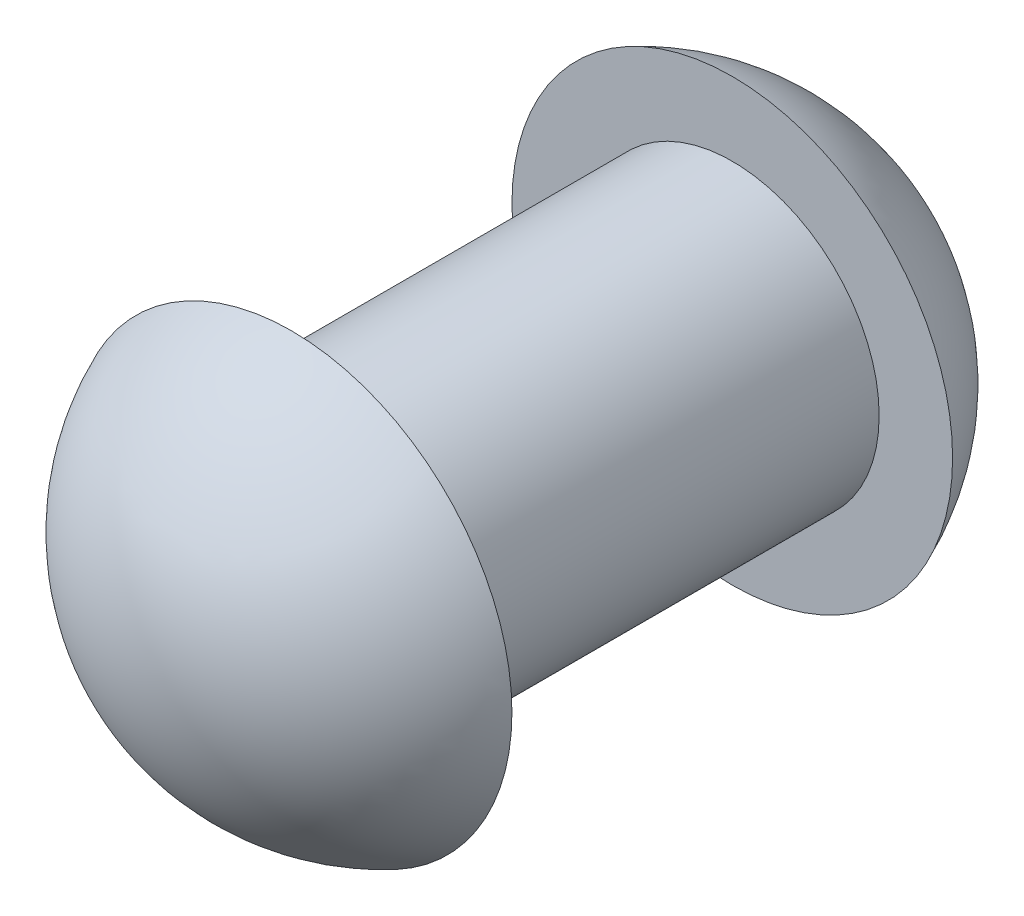
ISO-10303-21;
HEADER;
FILE_DESCRIPTION(('STEP AP214'),'2;1');
FILE_NAME('part.step','',(''),(''),'','','');
FILE_SCHEMA(('AUTOMOTIVE_DESIGN { 1 0 10303 214 1 1 1 1 }'));
ENDSEC;
DATA;
#1=APPLICATION_CONTEXT('core data for automotive mechanical design processes');
#2=APPLICATION_PROTOCOL_DEFINITION('international standard','automotive_design',2000,#1);
#3=PRODUCT_CONTEXT('',#1,'mechanical');
#4=PRODUCT('Part','Part','',(#3));
#5=PRODUCT_RELATED_PRODUCT_CATEGORY('part','',(#4));
#6=PRODUCT_DEFINITION_FORMATION('','',#4);
#7=PRODUCT_DEFINITION_CONTEXT('part definition',#1,'design');
#8=PRODUCT_DEFINITION('design','',#6,#7);
#9=PRODUCT_DEFINITION_SHAPE('','',#8);
#10=(LENGTH_UNIT() NAMED_UNIT(*) SI_UNIT(.MILLI.,.METRE.));
#11=(NAMED_UNIT(*) PLANE_ANGLE_UNIT() SI_UNIT($,.RADIAN.));
#12=(NAMED_UNIT(*) SI_UNIT($,.STERADIAN.) SOLID_ANGLE_UNIT());
#13=UNCERTAINTY_MEASURE_WITH_UNIT(LENGTH_MEASURE(1.E-05),#10,'distance_accuracy_value','');
#14=(GEOMETRIC_REPRESENTATION_CONTEXT(3) GLOBAL_UNCERTAINTY_ASSIGNED_CONTEXT((#13)) GLOBAL_UNIT_ASSIGNED_CONTEXT((#10,
#11,#12)) REPRESENTATION_CONTEXT('',''));
#15=CARTESIAN_POINT('',(0.,0.,0.));
#16=DIRECTION('',(0.,0.,1.));
#17=DIRECTION('',(1.,0.,0.));
#18=AXIS2_PLACEMENT_3D('',#15,#16,#17);
#19=CARTESIAN_POINT('',(0.,0.,-0.875));
#20=DIRECTION('',(0.,0.,-1.));
#21=DIRECTION('',(1.,0.,0.));
#22=AXIS2_PLACEMENT_3D('',#19,#20,#21);
#23=SPHERICAL_SURFACE('',#22,1.625);
#24=CARTESIAN_POINT('',(0.,0.,-1.5));
#25=DIRECTION('',(0.,0.,-1.));
#26=DIRECTION('',(-1.,0.,0.));
#27=AXIS2_PLACEMENT_3D('',#24,#25,#26);
#28=CIRCLE('',#27,1.5);
#29=CARTESIAN_POINT('',(-1.5,0.,-1.5));
#30=VERTEX_POINT('',#29);
#31=EDGE_CURVE('E10',#30,#30,#28,.T.);
#32=ORIENTED_EDGE('',*,*,#31,.T.);
#33=EDGE_LOOP('',(#32));
#34=FACE_BOUND('',#33,.T.);
#35=ADVANCED_FACE('F37',(#34),#23,.T.);
#36=CARTESIAN_POINT('',(1.5,0.,-1.5));
#37=DIRECTION('',(0.,0.,-1.));
#38=DIRECTION('',(-1.,0.,0.));
#39=AXIS2_PLACEMENT_3D('',#36,#37,#38);
#40=PLANE('',#39);
#41=ORIENTED_EDGE('',*,*,#31,.F.);
#42=EDGE_LOOP('',(#41));
#43=FACE_BOUND('',#42,.T.);
#44=CARTESIAN_POINT('',(0.,0.,-1.5));
#45=DIRECTION('',(0.,0.,-1.));
#46=DIRECTION('',(-1.,0.,0.));
#47=AXIS2_PLACEMENT_3D('',#44,#45,#46);
#48=CIRCLE('',#47,1.);
#49=CARTESIAN_POINT('',(-1.,0.,-1.5));
#50=VERTEX_POINT('',#49);
#51=EDGE_CURVE('E44',#50,#50,#48,.T.);
#52=ORIENTED_EDGE('',*,*,#51,.T.);
#53=EDGE_LOOP('',(#52));
#54=FACE_BOUND('',#53,.T.);
#55=ADVANCED_FACE('F73',(#43,#54),#40,.F.);
#56=CARTESIAN_POINT('',(0.,0.,-2.5));
#57=DIRECTION('',(0.,0.,-1.));
#58=DIRECTION('',(-1.,0.,0.));
#59=AXIS2_PLACEMENT_3D('',#56,#57,#58);
#60=CYLINDRICAL_SURFACE('',#59,1.);
#61=ORIENTED_EDGE('',*,*,#51,.F.);
#62=EDGE_LOOP('',(#61));
#63=FACE_BOUND('',#62,.T.);
#64=CARTESIAN_POINT('',(0.,0.,1.5));
#65=DIRECTION('',(0.,0.,-1.));
#66=DIRECTION('',(-1.,0.,0.));
#67=AXIS2_PLACEMENT_3D('',#64,#65,#66);
#68=CIRCLE('',#67,1.);
#69=CARTESIAN_POINT('',(-0.999999999999999,0.,1.5));
#70=VERTEX_POINT('',#69);
#71=EDGE_CURVE('E49',#70,#70,#68,.T.);
#72=ORIENTED_EDGE('',*,*,#71,.T.);
#73=EDGE_LOOP('',(#72));
#74=FACE_BOUND('',#73,.T.);
#75=ADVANCED_FACE('F69',(#63,#74),#60,.T.);
#76=CARTESIAN_POINT('',(1.,0.,1.5));
#77=DIRECTION('',(0.,0.,1.));
#78=DIRECTION('',(1.,0.,0.));
#79=AXIS2_PLACEMENT_3D('',#76,#77,#78);
#80=PLANE('',#79);
#81=ORIENTED_EDGE('',*,*,#71,.F.);
#82=EDGE_LOOP('',(#81));
#83=FACE_BOUND('',#82,.T.);
#84=CARTESIAN_POINT('',(0.,0.,1.5));
#85=DIRECTION('',(0.,0.,-1.));
#86=DIRECTION('',(-1.,0.,0.));
#87=AXIS2_PLACEMENT_3D('',#84,#85,#86);
#88=CIRCLE('',#87,1.5);
#89=CARTESIAN_POINT('',(-1.5,0.,1.5));
#90=VERTEX_POINT('',#89);
#91=EDGE_CURVE('E54',#90,#90,#88,.T.);
#92=ORIENTED_EDGE('',*,*,#91,.T.);
#93=EDGE_LOOP('',(#92));
#94=FACE_BOUND('',#93,.T.);
#95=ADVANCED_FACE('F61',(#83,#94),#80,.F.);
#96=CARTESIAN_POINT('',(0.,0.,0.875));
#97=DIRECTION('',(0.,0.,-1.));
#98=DIRECTION('',(1.,0.,0.));
#99=AXIS2_PLACEMENT_3D('',#96,#97,#98);
#100=SPHERICAL_SURFACE('',#99,1.625);
#101=ORIENTED_EDGE('',*,*,#91,.F.);
#102=EDGE_LOOP('',(#101));
#103=FACE_BOUND('',#102,.T.);
#104=ADVANCED_FACE('F63',(#103),#100,.T.);
#105=CLOSED_SHELL('',(#35,#55,#75,#95,#104));
#106=MANIFOLD_SOLID_BREP('B2',#105);
#107=ADVANCED_BREP_SHAPE_REPRESENTATION('',(#18,#106),#14);
#108=SHAPE_DEFINITION_REPRESENTATION(#9,#107);
ENDSEC;
END-ISO-10303-21;
